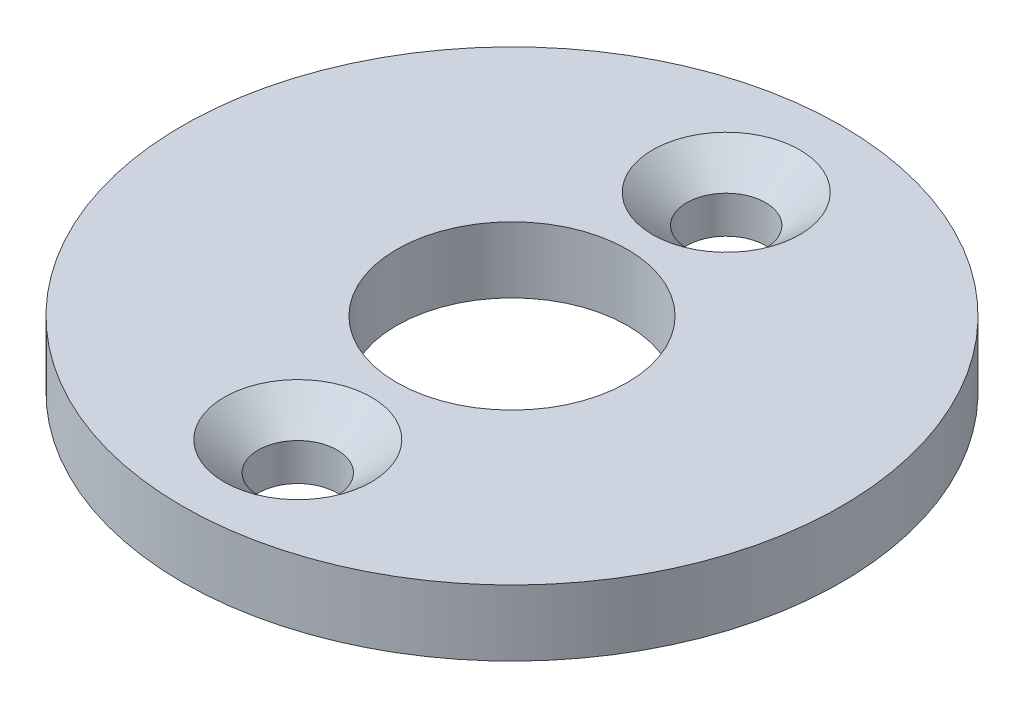
ISO-10303-21;
HEADER;
FILE_DESCRIPTION(('STEP AP214'),'2;1');
FILE_NAME('part.step','',(''),(''),'','','');
FILE_SCHEMA(('AUTOMOTIVE_DESIGN { 1 0 10303 214 1 1 1 1 }'));
ENDSEC;
DATA;
#1=APPLICATION_CONTEXT('core data for automotive mechanical design processes');
#2=APPLICATION_PROTOCOL_DEFINITION('international standard','automotive_design',2000,#1);
#3=PRODUCT_CONTEXT('',#1,'mechanical');
#4=PRODUCT('Part','Part','',(#3));
#5=PRODUCT_RELATED_PRODUCT_CATEGORY('part','',(#4));
#6=PRODUCT_DEFINITION_FORMATION('','',#4);
#7=PRODUCT_DEFINITION_CONTEXT('part definition',#1,'design');
#8=PRODUCT_DEFINITION('design','',#6,#7);
#9=PRODUCT_DEFINITION_SHAPE('','',#8);
#10=(LENGTH_UNIT() NAMED_UNIT(*) SI_UNIT(.MILLI.,.METRE.));
#11=(NAMED_UNIT(*) PLANE_ANGLE_UNIT() SI_UNIT($,.RADIAN.));
#12=(NAMED_UNIT(*) SI_UNIT($,.STERADIAN.) SOLID_ANGLE_UNIT());
#13=UNCERTAINTY_MEASURE_WITH_UNIT(LENGTH_MEASURE(1.E-05),#10,'distance_accuracy_value','');
#14=(GEOMETRIC_REPRESENTATION_CONTEXT(3) GLOBAL_UNCERTAINTY_ASSIGNED_CONTEXT((#13)) GLOBAL_UNIT_ASSIGNED_CONTEXT((#10,
#11,#12)) REPRESENTATION_CONTEXT('',''));
#15=CARTESIAN_POINT('',(0.,0.,0.));
#16=DIRECTION('',(0.,0.,1.));
#17=DIRECTION('',(1.,0.,0.));
#18=AXIS2_PLACEMENT_3D('',#15,#16,#17);
#19=CARTESIAN_POINT('',(0.,3.175,0.));
#20=DIRECTION('',(0.,1.,0.));
#21=DIRECTION('',(0.,0.,1.));
#22=AXIS2_PLACEMENT_3D('',#19,#20,#21);
#23=PLANE('',#22);
#24=CARTESIAN_POINT('',(0.,3.175,10.31875));
#25=DIRECTION('',(0.,1.,0.));
#26=DIRECTION('',(0.,0.,1.));
#27=AXIS2_PLACEMENT_3D('',#24,#25,#26);
#28=CIRCLE('',#27,3.5433);
#29=CARTESIAN_POINT('',(0.,3.175,13.86205));
#30=VERTEX_POINT('',#29);
#31=EDGE_CURVE('E66',#30,#30,#28,.T.);
#32=ORIENTED_EDGE('',*,*,#31,.F.);
#33=EDGE_LOOP('',(#32));
#34=FACE_BOUND('',#33,.T.);
#35=CARTESIAN_POINT('',(0.,3.175,-10.31875));
#36=DIRECTION('',(0.,1.,0.));
#37=DIRECTION('',(0.,0.,1.));
#38=AXIS2_PLACEMENT_3D('',#35,#36,#37);
#39=CIRCLE('',#38,3.5433);
#40=CARTESIAN_POINT('',(0.,3.175,-6.77545));
#41=VERTEX_POINT('',#40);
#42=EDGE_CURVE('E57',#41,#41,#39,.T.);
#43=ORIENTED_EDGE('',*,*,#42,.F.);
#44=EDGE_LOOP('',(#43));
#45=FACE_BOUND('',#44,.T.);
#46=CARTESIAN_POINT('',(0.,3.175,0.));
#47=DIRECTION('',(0.,1.,0.));
#48=DIRECTION('',(0.,0.,1.));
#49=AXIS2_PLACEMENT_3D('',#46,#47,#48);
#50=CIRCLE('',#49,15.875);
#51=CARTESIAN_POINT('',(0.,3.175,15.875));
#52=VERTEX_POINT('',#51);
#53=EDGE_CURVE('E10',#52,#52,#50,.T.);
#54=ORIENTED_EDGE('',*,*,#53,.T.);
#55=EDGE_LOOP('',(#54));
#56=FACE_BOUND('',#55,.T.);
#57=CARTESIAN_POINT('',(0.,3.175,0.));
#58=DIRECTION('',(0.,1.,0.));
#59=DIRECTION('',(0.,0.,1.));
#60=AXIS2_PLACEMENT_3D('',#57,#58,#59);
#61=CIRCLE('',#60,5.55625);
#62=CARTESIAN_POINT('',(0.,3.175,5.55625));
#63=VERTEX_POINT('',#62);
#64=EDGE_CURVE('E44',#63,#63,#61,.T.);
#65=ORIENTED_EDGE('',*,*,#64,.F.);
#66=EDGE_LOOP('',(#65));
#67=FACE_BOUND('',#66,.T.);
#68=ADVANCED_FACE('F33',(#34,#45,#56,#67),#23,.T.);
#69=CARTESIAN_POINT('',(0.,0.,0.));
#70=DIRECTION('',(0.,1.,0.));
#71=DIRECTION('',(0.,0.,1.));
#72=AXIS2_PLACEMENT_3D('',#69,#70,#71);
#73=PLANE('',#72);
#74=CARTESIAN_POINT('',(0.,0.,10.31875));
#75=DIRECTION('',(0.,1.,0.));
#76=DIRECTION('',(0.,0.,1.));
#77=AXIS2_PLACEMENT_3D('',#74,#75,#76);
#78=CIRCLE('',#77,1.89865);
#79=CARTESIAN_POINT('',(0.,0.,12.2174));
#80=VERTEX_POINT('',#79);
#81=EDGE_CURVE('E60',#80,#80,#78,.T.);
#82=ORIENTED_EDGE('',*,*,#81,.T.);
#83=EDGE_LOOP('',(#82));
#84=FACE_BOUND('',#83,.T.);
#85=CARTESIAN_POINT('',(0.,0.,-10.31875));
#86=DIRECTION('',(0.,1.,0.));
#87=DIRECTION('',(0.,0.,1.));
#88=AXIS2_PLACEMENT_3D('',#85,#86,#87);
#89=CIRCLE('',#88,1.89865);
#90=CARTESIAN_POINT('',(0.,0.,-8.4201));
#91=VERTEX_POINT('',#90);
#92=EDGE_CURVE('E49',#91,#91,#89,.T.);
#93=ORIENTED_EDGE('',*,*,#92,.T.);
#94=EDGE_LOOP('',(#93));
#95=FACE_BOUND('',#94,.T.);
#96=CARTESIAN_POINT('',(0.,0.,0.));
#97=DIRECTION('',(0.,1.,0.));
#98=DIRECTION('',(0.,0.,1.));
#99=AXIS2_PLACEMENT_3D('',#96,#97,#98);
#100=CIRCLE('',#99,15.875);
#101=CARTESIAN_POINT('',(0.,0.,15.875));
#102=VERTEX_POINT('',#101);
#103=EDGE_CURVE('E37',#102,#102,#100,.T.);
#104=ORIENTED_EDGE('',*,*,#103,.F.);
#105=EDGE_LOOP('',(#104));
#106=FACE_BOUND('',#105,.T.);
#107=CARTESIAN_POINT('',(0.,0.,0.));
#108=DIRECTION('',(0.,1.,0.));
#109=DIRECTION('',(0.,0.,1.));
#110=AXIS2_PLACEMENT_3D('',#107,#108,#109);
#111=CIRCLE('',#110,5.55625);
#112=CARTESIAN_POINT('',(0.,0.,5.55625));
#113=VERTEX_POINT('',#112);
#114=EDGE_CURVE('E46',#113,#113,#111,.T.);
#115=ORIENTED_EDGE('',*,*,#114,.T.);
#116=EDGE_LOOP('',(#115));
#117=FACE_BOUND('',#116,.T.);
#118=ADVANCED_FACE('F74',(#84,#95,#106,#117),#73,.F.);
#119=CARTESIAN_POINT('',(0.,3.175,0.));
#120=DIRECTION('',(0.,-1.,0.));
#121=DIRECTION('',(0.,0.,-1.));
#122=AXIS2_PLACEMENT_3D('',#119,#120,#121);
#123=CYLINDRICAL_SURFACE('',#122,15.875);
#124=ORIENTED_EDGE('',*,*,#53,.F.);
#125=EDGE_LOOP('',(#124));
#126=FACE_BOUND('',#125,.T.);
#127=ORIENTED_EDGE('',*,*,#103,.T.);
#128=EDGE_LOOP('',(#127));
#129=FACE_BOUND('',#128,.T.);
#130=ADVANCED_FACE('F35',(#126,#129),#123,.T.);
#131=CARTESIAN_POINT('',(0.,3.175,0.));
#132=DIRECTION('',(0.,-1.,0.));
#133=DIRECTION('',(0.,0.,-1.));
#134=AXIS2_PLACEMENT_3D('',#131,#132,#133);
#135=CYLINDRICAL_SURFACE('',#134,5.55625);
#136=ORIENTED_EDGE('',*,*,#64,.T.);
#137=EDGE_LOOP('',(#136));
#138=FACE_BOUND('',#137,.T.);
#139=ORIENTED_EDGE('',*,*,#114,.F.);
#140=EDGE_LOOP('',(#139));
#141=FACE_BOUND('',#140,.T.);
#142=ADVANCED_FACE('F80',(#138,#141),#135,.F.);
#143=CARTESIAN_POINT('',(0.,3.175,-10.31875));
#144=DIRECTION('',(0.,1.,0.));
#145=DIRECTION('',(0.,0.,1.));
#146=AXIS2_PLACEMENT_3D('',#143,#144,#145);
#147=CYLINDRICAL_SURFACE('',#146,1.89864999999999);
#148=ORIENTED_EDGE('',*,*,#92,.F.);
#149=EDGE_LOOP('',(#148));
#150=FACE_BOUND('',#149,.T.);
#151=CARTESIAN_POINT('',(0.,1.79497479158429,-10.31875));
#152=DIRECTION('',(0.,1.,0.));
#153=DIRECTION('',(0.,0.,1.));
#154=AXIS2_PLACEMENT_3D('',#151,#152,#153);
#155=CIRCLE('',#154,1.89864999999999);
#156=CARTESIAN_POINT('',(0.,1.79497479158429,-8.42010000000001));
#157=VERTEX_POINT('',#156);
#158=EDGE_CURVE('E54',#157,#157,#155,.T.);
#159=ORIENTED_EDGE('',*,*,#158,.T.);
#160=EDGE_LOOP('',(#159));
#161=FACE_BOUND('',#160,.T.);
#162=ADVANCED_FACE('F83',(#150,#161),#147,.F.);
#163=CARTESIAN_POINT('',(0.,3.175,-10.31875));
#164=DIRECTION('',(0.,1.,0.));
#165=DIRECTION('',(0.,0.,1.));
#166=AXIS2_PLACEMENT_3D('',#163,#164,#165);
#167=CONICAL_SURFACE('',#166,3.5433,0.872664625997169);
#168=ORIENTED_EDGE('',*,*,#158,.F.);
#169=EDGE_LOOP('',(#168));
#170=FACE_BOUND('',#169,.T.);
#171=ORIENTED_EDGE('',*,*,#42,.T.);
#172=EDGE_LOOP('',(#171));
#173=FACE_BOUND('',#172,.T.);
#174=ADVANCED_FACE('F97',(#170,#173),#167,.F.);
#175=CARTESIAN_POINT('',(0.,3.175,10.31875));
#176=DIRECTION('',(0.,1.,0.));
#177=DIRECTION('',(0.,0.,1.));
#178=AXIS2_PLACEMENT_3D('',#175,#176,#177);
#179=CYLINDRICAL_SURFACE('',#178,1.89864999999999);
#180=ORIENTED_EDGE('',*,*,#81,.F.);
#181=EDGE_LOOP('',(#180));
#182=FACE_BOUND('',#181,.T.);
#183=CARTESIAN_POINT('',(0.,1.79497479158429,10.31875));
#184=DIRECTION('',(0.,1.,0.));
#185=DIRECTION('',(0.,0.,1.));
#186=AXIS2_PLACEMENT_3D('',#183,#184,#185);
#187=CIRCLE('',#186,1.89864999999999);
#188=CARTESIAN_POINT('',(0.,1.79497479158429,12.2174));
#189=VERTEX_POINT('',#188);
#190=EDGE_CURVE('E63',#189,#189,#187,.T.);
#191=ORIENTED_EDGE('',*,*,#190,.T.);
#192=EDGE_LOOP('',(#191));
#193=FACE_BOUND('',#192,.T.);
#194=ADVANCED_FACE('F101',(#182,#193),#179,.F.);
#195=CARTESIAN_POINT('',(0.,3.175,10.31875));
#196=DIRECTION('',(0.,1.,0.));
#197=DIRECTION('',(0.,0.,1.));
#198=AXIS2_PLACEMENT_3D('',#195,#196,#197);
#199=CONICAL_SURFACE('',#198,3.5433,0.872664625997169);
#200=ORIENTED_EDGE('',*,*,#190,.F.);
#201=EDGE_LOOP('',(#200));
#202=FACE_BOUND('',#201,.T.);
#203=ORIENTED_EDGE('',*,*,#31,.T.);
#204=EDGE_LOOP('',(#203));
#205=FACE_BOUND('',#204,.T.);
#206=ADVANCED_FACE('F70',(#202,#205),#199,.F.);
#207=CLOSED_SHELL('',(#68,#118,#130,#142,#162,#174,#194,#206));
#208=MANIFOLD_SOLID_BREP('B2',#207);
#209=ADVANCED_BREP_SHAPE_REPRESENTATION('',(#18,#208),#14);
#210=SHAPE_DEFINITION_REPRESENTATION(#9,#209);
ENDSEC;
END-ISO-10303-21;
